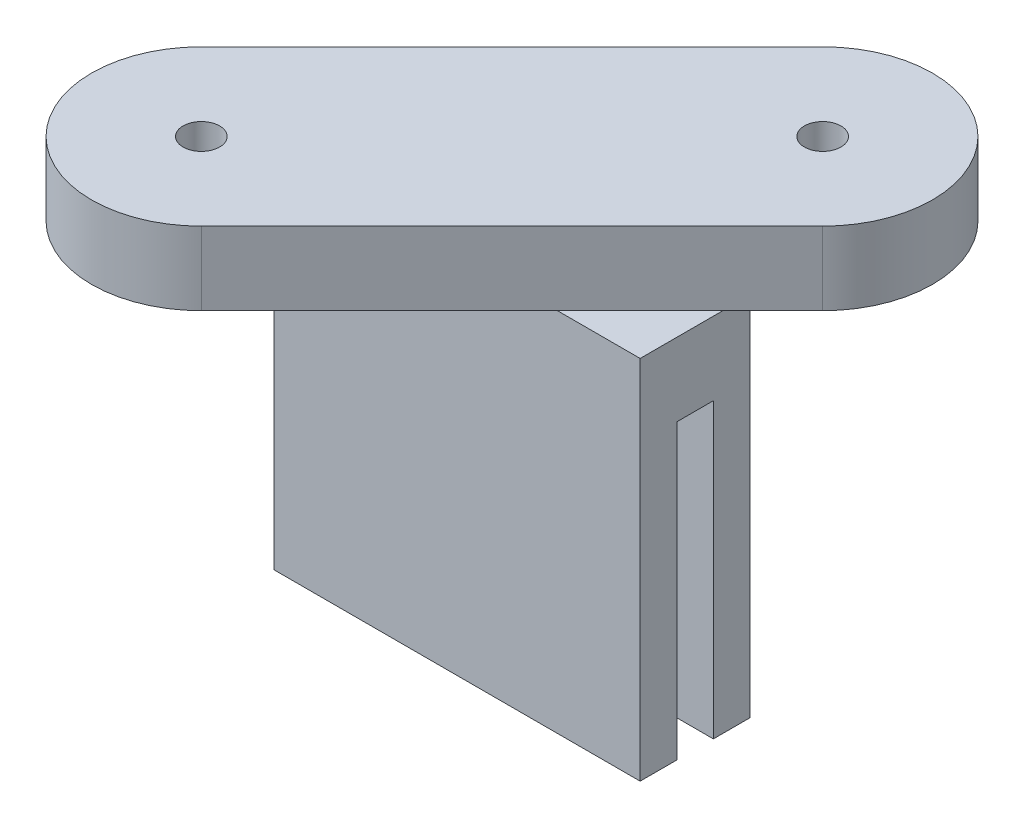
ISO-10303-21;
HEADER;
FILE_DESCRIPTION(('STEP AP214'),'2;1');
FILE_NAME('part.step','',(''),(''),'','','');
FILE_SCHEMA(('AUTOMOTIVE_DESIGN { 1 0 10303 214 1 1 1 1 }'));
ENDSEC;
DATA;
#1=APPLICATION_CONTEXT('core data for automotive mechanical design processes');
#2=APPLICATION_PROTOCOL_DEFINITION('international standard','automotive_design',2000,#1);
#3=PRODUCT_CONTEXT('',#1,'mechanical');
#4=PRODUCT('Part','Part','',(#3));
#5=PRODUCT_RELATED_PRODUCT_CATEGORY('part','',(#4));
#6=PRODUCT_DEFINITION_FORMATION('','',#4);
#7=PRODUCT_DEFINITION_CONTEXT('part definition',#1,'design');
#8=PRODUCT_DEFINITION('design','',#6,#7);
#9=PRODUCT_DEFINITION_SHAPE('','',#8);
#10=(LENGTH_UNIT() NAMED_UNIT(*) SI_UNIT(.MILLI.,.METRE.));
#11=(NAMED_UNIT(*) PLANE_ANGLE_UNIT() SI_UNIT($,.RADIAN.));
#12=(NAMED_UNIT(*) SI_UNIT($,.STERADIAN.) SOLID_ANGLE_UNIT());
#13=UNCERTAINTY_MEASURE_WITH_UNIT(LENGTH_MEASURE(1.E-05),#10,'distance_accuracy_value','');
#14=(GEOMETRIC_REPRESENTATION_CONTEXT(3) GLOBAL_UNCERTAINTY_ASSIGNED_CONTEXT((#13)) GLOBAL_UNIT_ASSIGNED_CONTEXT((#10,
#11,#12)) REPRESENTATION_CONTEXT('',''));
#15=CARTESIAN_POINT('',(0.,0.,0.));
#16=DIRECTION('',(0.,0.,1.));
#17=DIRECTION('',(1.,0.,0.));
#18=AXIS2_PLACEMENT_3D('',#15,#16,#17);
#19=CARTESIAN_POINT('',(0.,-100.,0.));
#20=DIRECTION('',(0.,1.,0.));
#21=DIRECTION('',(0.,0.,1.));
#22=AXIS2_PLACEMENT_3D('',#19,#20,#21);
#23=PLANE('',#22);
#24=DIRECTION('',(0.,0.,-1.));
#25=VECTOR('',#24,1.);
#26=CARTESIAN_POINT('',(-50.,-100.,15.));
#27=LINE('',#26,#25);
#28=CARTESIAN_POINT('',(-50.,-100.,15.));
#29=VERTEX_POINT('',#28);
#30=CARTESIAN_POINT('',(-50.,-100.,5.));
#31=VERTEX_POINT('',#30);
#32=EDGE_CURVE('E181',#29,#31,#27,.T.);
#33=ORIENTED_EDGE('',*,*,#32,.T.);
#34=DIRECTION('',(-1.,0.,0.));
#35=VECTOR('',#34,1.);
#36=CARTESIAN_POINT('',(50.,-100.,5.));
#37=LINE('',#36,#35);
#38=CARTESIAN_POINT('',(50.,-100.,5.));
#39=VERTEX_POINT('',#38);
#40=EDGE_CURVE('E163',#39,#31,#37,.T.);
#41=ORIENTED_EDGE('',*,*,#40,.F.);
#42=DIRECTION('',(0.,0.,1.));
#43=VECTOR('',#42,1.);
#44=CARTESIAN_POINT('',(50.,-100.,-15.));
#45=LINE('',#44,#43);
#46=CARTESIAN_POINT('',(50.,-100.,15.));
#47=VERTEX_POINT('',#46);
#48=EDGE_CURVE('E179',#39,#47,#45,.T.);
#49=ORIENTED_EDGE('',*,*,#48,.T.);
#50=DIRECTION('',(-1.,0.,0.));
#51=VECTOR('',#50,1.);
#52=CARTESIAN_POINT('',(-50.,-100.,15.));
#53=LINE('',#52,#51);
#54=EDGE_CURVE('E178',#47,#29,#53,.T.);
#55=ORIENTED_EDGE('',*,*,#54,.T.);
#56=EDGE_LOOP('',(#33,#41,#49,#55));
#57=FACE_BOUND('',#56,.T.);
#58=ADVANCED_FACE('F45',(#57),#23,.F.);
#59=CARTESIAN_POINT('',(42.4264068711926,0.,-42.4264068711931));
#60=DIRECTION('',(0.,1.,0.));
#61=DIRECTION('',(0.,0.,1.));
#62=AXIS2_PLACEMENT_3D('',#59,#60,#61);
#63=PLANE('',#62);
#64=CARTESIAN_POINT('',(42.4264068711926,0.,-42.4264068711931));
#65=DIRECTION('',(0.,1.,0.));
#66=DIRECTION('',(0.,0.,-1.));
#67=AXIS2_PLACEMENT_3D('',#64,#65,#66);
#68=CIRCLE('',#67,5.00000000000005);
#69=CARTESIAN_POINT('',(42.4264068711926,0.,-47.4264068711932));
#70=VERTEX_POINT('',#69);
#71=EDGE_CURVE('E208',#70,#70,#68,.T.);
#72=ORIENTED_EDGE('',*,*,#71,.T.);
#73=EDGE_LOOP('',(#72));
#74=FACE_BOUND('',#73,.T.);
#75=DIRECTION('',(0.,0.,1.));
#76=VECTOR('',#75,1.);
#77=CARTESIAN_POINT('',(50.,0.,-15.));
#78=LINE('',#77,#76);
#79=CARTESIAN_POINT('',(50.,0.,-15.));
#80=VERTEX_POINT('',#79);
#81=CARTESIAN_POINT('',(50.,0.,-7.57359312880746));
#82=VERTEX_POINT('',#81);
#83=EDGE_CURVE('E71',#80,#82,#78,.T.);
#84=ORIENTED_EDGE('',*,*,#83,.F.);
#85=DIRECTION('',(1.,0.,0.));
#86=VECTOR('',#85,1.);
#87=CARTESIAN_POINT('',(-50.,0.,-15.));
#88=LINE('',#87,#86);
#89=CARTESIAN_POINT('',(-27.4264068711928,0.,-15.));
#90=VERTEX_POINT('',#89);
#91=EDGE_CURVE('E11',#90,#80,#88,.T.);
#92=ORIENTED_EDGE('',*,*,#91,.F.);
#93=DIRECTION('',(-0.707106781186544,0.,0.707106781186551));
#94=VECTOR('',#93,1.);
#95=CARTESIAN_POINT('',(21.2132034355961,0.,-63.6396103067894));
#96=LINE('',#95,#94);
#97=CARTESIAN_POINT('',(21.2132034355961,0.,-63.6396103067894));
#98=VERTEX_POINT('',#97);
#99=EDGE_CURVE('E235',#98,#90,#96,.T.);
#100=ORIENTED_EDGE('',*,*,#99,.F.);
#101=CARTESIAN_POINT('',(42.4264068711926,0.,-42.4264068711931));
#102=DIRECTION('',(0.,1.,0.));
#103=DIRECTION('',(0.,0.,1.));
#104=AXIS2_PLACEMENT_3D('',#101,#102,#103);
#105=CIRCLE('',#104,30.);
#106=CARTESIAN_POINT('',(63.6396103067892,0.,-21.2132034355968));
#107=VERTEX_POINT('',#106);
#108=EDGE_CURVE('E218',#107,#98,#105,.T.);
#109=ORIENTED_EDGE('',*,*,#108,.F.);
#110=DIRECTION('',(0.707106781186543,0.,-0.707106781186552));
#111=VECTOR('',#110,1.);
#112=CARTESIAN_POINT('',(63.6396103067892,0.,-21.2132034355968));
#113=LINE('',#112,#111);
#114=EDGE_CURVE('E241',#82,#107,#113,.T.);
#115=ORIENTED_EDGE('',*,*,#114,.F.);
#116=EDGE_LOOP('',(#84,#92,#100,#109,#115));
#117=FACE_BOUND('',#116,.T.);
#118=ADVANCED_FACE('F287',(#74,#117),#63,.F.);
#119=CARTESIAN_POINT('',(-42.4264068711926,0.,42.4264068711931));
#120=DIRECTION('',(0.,1.,0.));
#121=DIRECTION('',(0.,0.,1.));
#122=AXIS2_PLACEMENT_3D('',#119,#120,#121);
#123=CIRCLE('',#122,5.00000000000001);
#124=CARTESIAN_POINT('',(-42.4264068711926,0.,47.4264068711931));
#125=VERTEX_POINT('',#124);
#126=EDGE_CURVE('E212',#125,#125,#123,.T.);
#127=ORIENTED_EDGE('',*,*,#126,.T.);
#128=EDGE_LOOP('',(#127));
#129=FACE_BOUND('',#128,.T.);
#130=DIRECTION('',(0.,0.,-1.));
#131=VECTOR('',#130,1.);
#132=CARTESIAN_POINT('',(-50.,0.,15.));
#133=LINE('',#132,#131);
#134=CARTESIAN_POINT('',(-50.,0.,15.));
#135=VERTEX_POINT('',#134);
#136=CARTESIAN_POINT('',(-50.,0.,7.57359312880745));
#137=VERTEX_POINT('',#136);
#138=EDGE_CURVE('E193',#135,#137,#133,.T.);
#139=ORIENTED_EDGE('',*,*,#138,.F.);
#140=DIRECTION('',(-1.,0.,0.));
#141=VECTOR('',#140,1.);
#142=CARTESIAN_POINT('',(-50.,0.,15.));
#143=LINE('',#142,#141);
#144=CARTESIAN_POINT('',(27.4264068711928,0.,15.));
#145=VERTEX_POINT('',#144);
#146=EDGE_CURVE('E54',#145,#135,#143,.T.);
#147=ORIENTED_EDGE('',*,*,#146,.F.);
#148=CARTESIAN_POINT('',(-21.2132034355964,0.,63.6396103067898));
#149=VERTEX_POINT('',#148);
#150=EDGE_CURVE('E225',#149,#145,#113,.T.);
#151=ORIENTED_EDGE('',*,*,#150,.F.);
#152=CARTESIAN_POINT('',(-42.4264068711926,0.,42.4264068711931));
#153=DIRECTION('',(0.,1.,0.));
#154=DIRECTION('',(0.,0.,1.));
#155=AXIS2_PLACEMENT_3D('',#152,#153,#154);
#156=CIRCLE('',#155,30.);
#157=CARTESIAN_POINT('',(-63.6396103067895,0.,21.2132034355971));
#158=VERTEX_POINT('',#157);
#159=EDGE_CURVE('E238',#158,#149,#156,.T.);
#160=ORIENTED_EDGE('',*,*,#159,.F.);
#161=EDGE_CURVE('E234',#137,#158,#96,.T.);
#162=ORIENTED_EDGE('',*,*,#161,.F.);
#163=EDGE_LOOP('',(#139,#147,#151,#160,#162));
#164=FACE_BOUND('',#163,.T.);
#165=ADVANCED_FACE('F322',(#129,#164),#63,.F.);
#166=CARTESIAN_POINT('',(42.4264068711926,20.,-42.4264068711931));
#167=DIRECTION('',(0.,1.,0.));
#168=DIRECTION('',(0.,0.,1.));
#169=AXIS2_PLACEMENT_3D('',#166,#167,#168);
#170=PLANE('',#169);
#171=CARTESIAN_POINT('',(-42.4264068711926,20.,42.4264068711931));
#172=DIRECTION('',(0.,1.,0.));
#173=DIRECTION('',(0.,0.,1.));
#174=AXIS2_PLACEMENT_3D('',#171,#172,#173);
#175=CIRCLE('',#174,5.00000000000001);
#176=CARTESIAN_POINT('',(-42.4264068711926,20.,47.4264068711931));
#177=VERTEX_POINT('',#176);
#178=EDGE_CURVE('E215',#177,#177,#175,.T.);
#179=ORIENTED_EDGE('',*,*,#178,.F.);
#180=EDGE_LOOP('',(#179));
#181=FACE_BOUND('',#180,.T.);
#182=CARTESIAN_POINT('',(42.4264068711926,20.,-42.4264068711931));
#183=DIRECTION('',(0.,1.,0.));
#184=DIRECTION('',(0.,0.,1.));
#185=AXIS2_PLACEMENT_3D('',#182,#183,#184);
#186=CIRCLE('',#185,30.);
#187=CARTESIAN_POINT('',(63.6396103067892,20.,-21.2132034355968));
#188=VERTEX_POINT('',#187);
#189=CARTESIAN_POINT('',(21.2132034355961,20.,-63.6396103067894));
#190=VERTEX_POINT('',#189);
#191=EDGE_CURVE('E221',#188,#190,#186,.T.);
#192=ORIENTED_EDGE('',*,*,#191,.T.);
#193=DIRECTION('',(-0.707106781186544,0.,0.707106781186551));
#194=VECTOR('',#193,1.);
#195=CARTESIAN_POINT('',(21.2132034355961,20.,-63.6396103067894));
#196=LINE('',#195,#194);
#197=CARTESIAN_POINT('',(-63.6396103067895,20.,21.2132034355971));
#198=VERTEX_POINT('',#197);
#199=EDGE_CURVE('E224',#190,#198,#196,.T.);
#200=ORIENTED_EDGE('',*,*,#199,.T.);
#201=CARTESIAN_POINT('',(-42.4264068711926,20.,42.4264068711931));
#202=DIRECTION('',(0.,1.,0.));
#203=DIRECTION('',(0.,0.,1.));
#204=AXIS2_PLACEMENT_3D('',#201,#202,#203);
#205=CIRCLE('',#204,30.);
#206=CARTESIAN_POINT('',(-21.2132034355964,20.,63.6396103067898));
#207=VERTEX_POINT('',#206);
#208=EDGE_CURVE('E227',#198,#207,#205,.T.);
#209=ORIENTED_EDGE('',*,*,#208,.T.);
#210=DIRECTION('',(0.707106781186543,0.,-0.707106781186552));
#211=VECTOR('',#210,1.);
#212=CARTESIAN_POINT('',(63.6396103067892,20.,-21.2132034355968));
#213=LINE('',#212,#211);
#214=EDGE_CURVE('E229',#207,#188,#213,.T.);
#215=ORIENTED_EDGE('',*,*,#214,.T.);
#216=EDGE_LOOP('',(#192,#200,#209,#215));
#217=FACE_BOUND('',#216,.T.);
#218=CARTESIAN_POINT('',(42.4264068711926,20.,-42.4264068711931));
#219=DIRECTION('',(0.,1.,0.));
#220=DIRECTION('',(0.,0.,-1.));
#221=AXIS2_PLACEMENT_3D('',#218,#219,#220);
#222=CIRCLE('',#221,5.00000000000005);
#223=CARTESIAN_POINT('',(42.4264068711926,20.,-47.4264068711932));
#224=VERTEX_POINT('',#223);
#225=EDGE_CURVE('E209',#224,#224,#222,.T.);
#226=ORIENTED_EDGE('',*,*,#225,.F.);
#227=EDGE_LOOP('',(#226));
#228=FACE_BOUND('',#227,.T.);
#229=ADVANCED_FACE('F344',(#181,#217,#228),#170,.T.);
#230=CARTESIAN_POINT('',(42.4264068711926,20.,-42.4264068711931));
#231=DIRECTION('',(0.,-1.,0.));
#232=DIRECTION('',(0.,0.,-1.));
#233=AXIS2_PLACEMENT_3D('',#230,#231,#232);
#234=CYLINDRICAL_SURFACE('',#233,30.);
#235=ORIENTED_EDGE('',*,*,#108,.T.);
#236=DIRECTION('',(0.,-1.,0.));
#237=VECTOR('',#236,1.);
#238=CARTESIAN_POINT('',(21.2132034355961,20.,-63.6396103067894));
#239=LINE('',#238,#237);
#240=EDGE_CURVE('E49',#190,#98,#239,.T.);
#241=ORIENTED_EDGE('',*,*,#240,.F.);
#242=ORIENTED_EDGE('',*,*,#191,.F.);
#243=DIRECTION('',(0.,-1.,0.));
#244=VECTOR('',#243,1.);
#245=CARTESIAN_POINT('',(63.6396103067892,20.,-21.2132034355968));
#246=LINE('',#245,#244);
#247=EDGE_CURVE('E231',#188,#107,#246,.T.);
#248=ORIENTED_EDGE('',*,*,#247,.T.);
#249=EDGE_LOOP('',(#235,#241,#242,#248));
#250=FACE_BOUND('',#249,.T.);
#251=ADVANCED_FACE('F47',(#250),#234,.T.);
#252=CARTESIAN_POINT('',(21.2132034355961,20.,-63.6396103067894));
#253=DIRECTION('',(0.707106781186551,0.,0.707106781186544));
#254=DIRECTION('',(0.707106781186544,0.,-0.707106781186551));
#255=AXIS2_PLACEMENT_3D('',#252,#253,#254);
#256=PLANE('',#255);
#257=ORIENTED_EDGE('',*,*,#99,.T.);
#258=EDGE_CURVE('E239',#90,#137,#96,.T.);
#259=ORIENTED_EDGE('',*,*,#258,.T.);
#260=ORIENTED_EDGE('',*,*,#161,.T.);
#261=DIRECTION('',(0.,-1.,0.));
#262=VECTOR('',#261,1.);
#263=CARTESIAN_POINT('',(-63.6396103067895,20.,21.2132034355971));
#264=LINE('',#263,#262);
#265=EDGE_CURVE('E249',#198,#158,#264,.T.);
#266=ORIENTED_EDGE('',*,*,#265,.F.);
#267=ORIENTED_EDGE('',*,*,#199,.F.);
#268=ORIENTED_EDGE('',*,*,#240,.T.);
#269=EDGE_LOOP('',(#257,#259,#260,#266,#267,#268));
#270=FACE_BOUND('',#269,.T.);
#271=ADVANCED_FACE('F290',(#270),#256,.F.);
#272=CARTESIAN_POINT('',(-42.4264068711926,20.,42.4264068711931));
#273=DIRECTION('',(0.,-1.,0.));
#274=DIRECTION('',(0.,0.,-1.));
#275=AXIS2_PLACEMENT_3D('',#272,#273,#274);
#276=CYLINDRICAL_SURFACE('',#275,30.);
#277=ORIENTED_EDGE('',*,*,#159,.T.);
#278=DIRECTION('',(0.,-1.,0.));
#279=VECTOR('',#278,1.);
#280=CARTESIAN_POINT('',(-21.2132034355964,20.,63.6396103067898));
#281=LINE('',#280,#279);
#282=EDGE_CURVE('E247',#207,#149,#281,.T.);
#283=ORIENTED_EDGE('',*,*,#282,.F.);
#284=ORIENTED_EDGE('',*,*,#208,.F.);
#285=ORIENTED_EDGE('',*,*,#265,.T.);
#286=EDGE_LOOP('',(#277,#283,#284,#285));
#287=FACE_BOUND('',#286,.T.);
#288=ADVANCED_FACE('F350',(#287),#276,.T.);
#289=CARTESIAN_POINT('',(63.6396103067892,20.,-21.2132034355968));
#290=DIRECTION('',(-0.707106781186552,0.,-0.707106781186543));
#291=DIRECTION('',(-0.707106781186543,0.,0.707106781186552));
#292=AXIS2_PLACEMENT_3D('',#289,#290,#291);
#293=PLANE('',#292);
#294=ORIENTED_EDGE('',*,*,#150,.T.);
#295=EDGE_CURVE('E244',#145,#82,#113,.T.);
#296=ORIENTED_EDGE('',*,*,#295,.T.);
#297=ORIENTED_EDGE('',*,*,#114,.T.);
#298=ORIENTED_EDGE('',*,*,#247,.F.);
#299=ORIENTED_EDGE('',*,*,#214,.F.);
#300=ORIENTED_EDGE('',*,*,#282,.T.);
#301=EDGE_LOOP('',(#294,#296,#297,#298,#299,#300));
#302=FACE_BOUND('',#301,.T.);
#303=ADVANCED_FACE('F282',(#302),#293,.F.);
#304=CARTESIAN_POINT('',(-42.4264068711926,20.,42.4264068711931));
#305=DIRECTION('',(0.,-1.,0.));
#306=DIRECTION('',(0.,0.,-1.));
#307=AXIS2_PLACEMENT_3D('',#304,#305,#306);
#308=CYLINDRICAL_SURFACE('',#307,5.00000000000001);
#309=ORIENTED_EDGE('',*,*,#178,.T.);
#310=EDGE_LOOP('',(#309));
#311=FACE_BOUND('',#310,.T.);
#312=ORIENTED_EDGE('',*,*,#126,.F.);
#313=EDGE_LOOP('',(#312));
#314=FACE_BOUND('',#313,.T.);
#315=ADVANCED_FACE('F339',(#311,#314),#308,.F.);
#316=CARTESIAN_POINT('',(42.4264068711926,20.,-42.4264068711931));
#317=DIRECTION('',(0.,-1.,0.));
#318=DIRECTION('',(0.,0.,-1.));
#319=AXIS2_PLACEMENT_3D('',#316,#317,#318);
#320=CYLINDRICAL_SURFACE('',#319,5.00000000000005);
#321=ORIENTED_EDGE('',*,*,#225,.T.);
#322=EDGE_LOOP('',(#321));
#323=FACE_BOUND('',#322,.T.);
#324=ORIENTED_EDGE('',*,*,#71,.F.);
#325=EDGE_LOOP('',(#324));
#326=FACE_BOUND('',#325,.T.);
#327=ADVANCED_FACE('F328',(#323,#326),#320,.F.);
#328=CARTESIAN_POINT('',(0.,0.,0.));
#329=DIRECTION('',(0.,1.,0.));
#330=DIRECTION('',(0.,0.,1.));
#331=AXIS2_PLACEMENT_3D('',#328,#329,#330);
#332=PLANE('',#331);
#333=ORIENTED_EDGE('',*,*,#295,.F.);
#334=CARTESIAN_POINT('',(50.,0.,15.));
#335=VERTEX_POINT('',#334);
#336=EDGE_CURVE('E188',#335,#145,#143,.T.);
#337=ORIENTED_EDGE('',*,*,#336,.F.);
#338=EDGE_CURVE('E189',#82,#335,#78,.T.);
#339=ORIENTED_EDGE('',*,*,#338,.F.);
#340=EDGE_LOOP('',(#333,#337,#339));
#341=FACE_BOUND('',#340,.T.);
#342=ADVANCED_FACE('F278',(#341),#332,.T.);
#343=ORIENTED_EDGE('',*,*,#258,.F.);
#344=CARTESIAN_POINT('',(-50.,0.,-15.));
#345=VERTEX_POINT('',#344);
#346=EDGE_CURVE('E56',#345,#90,#88,.T.);
#347=ORIENTED_EDGE('',*,*,#346,.F.);
#348=EDGE_CURVE('E192',#137,#345,#133,.T.);
#349=ORIENTED_EDGE('',*,*,#348,.F.);
#350=EDGE_LOOP('',(#343,#347,#349));
#351=FACE_BOUND('',#350,.T.);
#352=ADVANCED_FACE('F294',(#351),#332,.T.);
#353=CARTESIAN_POINT('',(50.,-100.,-15.));
#354=DIRECTION('',(-1.,0.,0.));
#355=DIRECTION('',(0.,0.,1.));
#356=AXIS2_PLACEMENT_3D('',#353,#354,#355);
#357=PLANE('',#356);
#358=ORIENTED_EDGE('',*,*,#48,.F.);
#359=DIRECTION('',(0.,-1.,0.));
#360=VECTOR('',#359,1.);
#361=CARTESIAN_POINT('',(50.,-20.,5.));
#362=LINE('',#361,#360);
#363=CARTESIAN_POINT('',(50.,-20.,5.));
#364=VERTEX_POINT('',#363);
#365=EDGE_CURVE('E170',#364,#39,#362,.T.);
#366=ORIENTED_EDGE('',*,*,#365,.F.);
#367=DIRECTION('',(0.,0.,1.));
#368=VECTOR('',#367,1.);
#369=CARTESIAN_POINT('',(50.,-20.,-5.));
#370=LINE('',#369,#368);
#371=CARTESIAN_POINT('',(50.,-20.,-5.));
#372=VERTEX_POINT('',#371);
#373=EDGE_CURVE('E153',#372,#364,#370,.T.);
#374=ORIENTED_EDGE('',*,*,#373,.F.);
#375=DIRECTION('',(0.,-1.,0.));
#376=VECTOR('',#375,1.);
#377=CARTESIAN_POINT('',(50.,-20.,-5.));
#378=LINE('',#377,#376);
#379=CARTESIAN_POINT('',(50.,-100.,-5.));
#380=VERTEX_POINT('',#379);
#381=EDGE_CURVE('E150',#372,#380,#378,.T.);
#382=ORIENTED_EDGE('',*,*,#381,.T.);
#383=CARTESIAN_POINT('',(50.,-100.,-15.));
#384=VERTEX_POINT('',#383);
#385=EDGE_CURVE('E175',#384,#380,#45,.T.);
#386=ORIENTED_EDGE('',*,*,#385,.F.);
#387=DIRECTION('',(0.,1.,0.));
#388=VECTOR('',#387,1.);
#389=CARTESIAN_POINT('',(50.,-100.,-15.));
#390=LINE('',#389,#388);
#391=EDGE_CURVE('E186',#384,#80,#390,.T.);
#392=ORIENTED_EDGE('',*,*,#391,.T.);
#393=ORIENTED_EDGE('',*,*,#83,.T.);
#394=ORIENTED_EDGE('',*,*,#338,.T.);
#395=DIRECTION('',(0.,1.,0.));
#396=VECTOR('',#395,1.);
#397=CARTESIAN_POINT('',(50.,-100.,15.));
#398=LINE('',#397,#396);
#399=EDGE_CURVE('E205',#47,#335,#398,.T.);
#400=ORIENTED_EDGE('',*,*,#399,.F.);
#401=EDGE_LOOP('',(#358,#366,#374,#382,#386,#392,#393,#394,#400));
#402=FACE_BOUND('',#401,.T.);
#403=ADVANCED_FACE('F273',(#402),#357,.F.);
#404=CARTESIAN_POINT('',(-50.,-100.,15.));
#405=DIRECTION('',(0.,0.,-1.));
#406=DIRECTION('',(-1.,0.,0.));
#407=AXIS2_PLACEMENT_3D('',#404,#405,#406);
#408=PLANE('',#407);
#409=ORIENTED_EDGE('',*,*,#336,.T.);
#410=ORIENTED_EDGE('',*,*,#146,.T.);
#411=DIRECTION('',(0.,1.,0.));
#412=VECTOR('',#411,1.);
#413=CARTESIAN_POINT('',(-50.,-100.,15.));
#414=LINE('',#413,#412);
#415=EDGE_CURVE('E202',#29,#135,#414,.T.);
#416=ORIENTED_EDGE('',*,*,#415,.F.);
#417=ORIENTED_EDGE('',*,*,#54,.F.);
#418=ORIENTED_EDGE('',*,*,#399,.T.);
#419=EDGE_LOOP('',(#409,#410,#416,#417,#418));
#420=FACE_BOUND('',#419,.T.);
#421=ADVANCED_FACE('F261',(#420),#408,.F.);
#422=CARTESIAN_POINT('',(-50.,-100.,15.));
#423=DIRECTION('',(1.,0.,0.));
#424=DIRECTION('',(0.,0.,-1.));
#425=AXIS2_PLACEMENT_3D('',#422,#423,#424);
#426=PLANE('',#425);
#427=DIRECTION('',(0.,0.,-1.));
#428=VECTOR('',#427,1.);
#429=CARTESIAN_POINT('',(-50.,-20.,-5.));
#430=LINE('',#429,#428);
#431=CARTESIAN_POINT('',(-50.,-20.,5.));
#432=VERTEX_POINT('',#431);
#433=CARTESIAN_POINT('',(-50.,-20.,-5.));
#434=VERTEX_POINT('',#433);
#435=EDGE_CURVE('E154',#432,#434,#430,.T.);
#436=ORIENTED_EDGE('',*,*,#435,.F.);
#437=DIRECTION('',(0.,-1.,0.));
#438=VECTOR('',#437,1.);
#439=CARTESIAN_POINT('',(-50.,-20.,5.));
#440=LINE('',#439,#438);
#441=EDGE_CURVE('E267',#432,#31,#440,.T.);
#442=ORIENTED_EDGE('',*,*,#441,.T.);
#443=ORIENTED_EDGE('',*,*,#32,.F.);
#444=ORIENTED_EDGE('',*,*,#415,.T.);
#445=ORIENTED_EDGE('',*,*,#138,.T.);
#446=ORIENTED_EDGE('',*,*,#348,.T.);
#447=DIRECTION('',(0.,1.,0.));
#448=VECTOR('',#447,1.);
#449=CARTESIAN_POINT('',(-50.,-100.,-15.));
#450=LINE('',#449,#448);
#451=CARTESIAN_POINT('',(-50.,-100.,-15.));
#452=VERTEX_POINT('',#451);
#453=EDGE_CURVE('E199',#452,#345,#450,.T.);
#454=ORIENTED_EDGE('',*,*,#453,.F.);
#455=CARTESIAN_POINT('',(-50.,-100.,-5.));
#456=VERTEX_POINT('',#455);
#457=EDGE_CURVE('E168',#456,#452,#27,.T.);
#458=ORIENTED_EDGE('',*,*,#457,.F.);
#459=DIRECTION('',(0.,-1.,0.));
#460=VECTOR('',#459,1.);
#461=CARTESIAN_POINT('',(-50.,-20.,-5.));
#462=LINE('',#461,#460);
#463=EDGE_CURVE('E63',#434,#456,#462,.T.);
#464=ORIENTED_EDGE('',*,*,#463,.F.);
#465=EDGE_LOOP('',(#436,#442,#443,#444,#445,#446,#454,#458,#464));
#466=FACE_BOUND('',#465,.T.);
#467=ADVANCED_FACE('F166',(#466),#426,.F.);
#468=CARTESIAN_POINT('',(-50.,-100.,-15.));
#469=DIRECTION('',(0.,0.,1.));
#470=DIRECTION('',(1.,0.,0.));
#471=AXIS2_PLACEMENT_3D('',#468,#469,#470);
#472=PLANE('',#471);
#473=ORIENTED_EDGE('',*,*,#346,.T.);
#474=ORIENTED_EDGE('',*,*,#91,.T.);
#475=ORIENTED_EDGE('',*,*,#391,.F.);
#476=DIRECTION('',(1.,0.,0.));
#477=VECTOR('',#476,1.);
#478=CARTESIAN_POINT('',(-50.,-100.,-15.));
#479=LINE('',#478,#477);
#480=EDGE_CURVE('E184',#452,#384,#479,.T.);
#481=ORIENTED_EDGE('',*,*,#480,.F.);
#482=ORIENTED_EDGE('',*,*,#453,.T.);
#483=EDGE_LOOP('',(#473,#474,#475,#481,#482));
#484=FACE_BOUND('',#483,.T.);
#485=ADVANCED_FACE('F296',(#484),#472,.F.);
#486=ORIENTED_EDGE('',*,*,#385,.T.);
#487=DIRECTION('',(1.,0.,0.));
#488=VECTOR('',#487,1.);
#489=CARTESIAN_POINT('',(50.,-100.,-5.));
#490=LINE('',#489,#488);
#491=EDGE_CURVE('E302',#456,#380,#490,.T.);
#492=ORIENTED_EDGE('',*,*,#491,.F.);
#493=ORIENTED_EDGE('',*,*,#457,.T.);
#494=ORIENTED_EDGE('',*,*,#480,.T.);
#495=EDGE_LOOP('',(#486,#492,#493,#494));
#496=FACE_BOUND('',#495,.T.);
#497=ADVANCED_FACE('F301',(#496),#23,.F.);
#498=CARTESIAN_POINT('',(50.,-20.,5.));
#499=DIRECTION('',(0.,0.,1.));
#500=DIRECTION('',(1.,0.,0.));
#501=AXIS2_PLACEMENT_3D('',#498,#499,#500);
#502=PLANE('',#501);
#503=ORIENTED_EDGE('',*,*,#40,.T.);
#504=ORIENTED_EDGE('',*,*,#441,.F.);
#505=DIRECTION('',(-1.,0.,0.));
#506=VECTOR('',#505,1.);
#507=CARTESIAN_POINT('',(50.,-20.,5.));
#508=LINE('',#507,#506);
#509=EDGE_CURVE('E160',#364,#432,#508,.T.);
#510=ORIENTED_EDGE('',*,*,#509,.F.);
#511=ORIENTED_EDGE('',*,*,#365,.T.);
#512=EDGE_LOOP('',(#503,#504,#510,#511));
#513=FACE_BOUND('',#512,.T.);
#514=ADVANCED_FACE('F308',(#513),#502,.F.);
#515=CARTESIAN_POINT('',(50.,-20.,-5.));
#516=DIRECTION('',(0.,0.,-1.));
#517=DIRECTION('',(-1.,0.,0.));
#518=AXIS2_PLACEMENT_3D('',#515,#516,#517);
#519=PLANE('',#518);
#520=ORIENTED_EDGE('',*,*,#491,.T.);
#521=ORIENTED_EDGE('',*,*,#381,.F.);
#522=DIRECTION('',(1.,0.,0.));
#523=VECTOR('',#522,1.);
#524=CARTESIAN_POINT('',(50.,-20.,-5.));
#525=LINE('',#524,#523);
#526=EDGE_CURVE('E146',#434,#372,#525,.T.);
#527=ORIENTED_EDGE('',*,*,#526,.F.);
#528=ORIENTED_EDGE('',*,*,#463,.T.);
#529=EDGE_LOOP('',(#520,#521,#527,#528));
#530=FACE_BOUND('',#529,.T.);
#531=ADVANCED_FACE('F148',(#530),#519,.F.);
#532=CARTESIAN_POINT('',(0.,-20.,0.));
#533=DIRECTION('',(0.,-1.,0.));
#534=DIRECTION('',(0.,0.,-1.));
#535=AXIS2_PLACEMENT_3D('',#532,#533,#534);
#536=PLANE('',#535);
#537=ORIENTED_EDGE('',*,*,#435,.T.);
#538=ORIENTED_EDGE('',*,*,#526,.T.);
#539=ORIENTED_EDGE('',*,*,#373,.T.);
#540=ORIENTED_EDGE('',*,*,#509,.T.);
#541=EDGE_LOOP('',(#537,#538,#539,#540));
#542=FACE_BOUND('',#541,.T.);
#543=ADVANCED_FACE('F158',(#542),#536,.T.);
#544=CLOSED_SHELL('',(#58,#118,#165,#229,#251,#271,#288,#303,#315,#327,#342,#352,#403,#421,#467,
#485,#497,#514,#531,#543));
#545=MANIFOLD_SOLID_BREP('B2',#544);
#546=ADVANCED_BREP_SHAPE_REPRESENTATION('',(#18,#545),#14);
#547=SHAPE_DEFINITION_REPRESENTATION(#9,#546);
ENDSEC;
END-ISO-10303-21;
